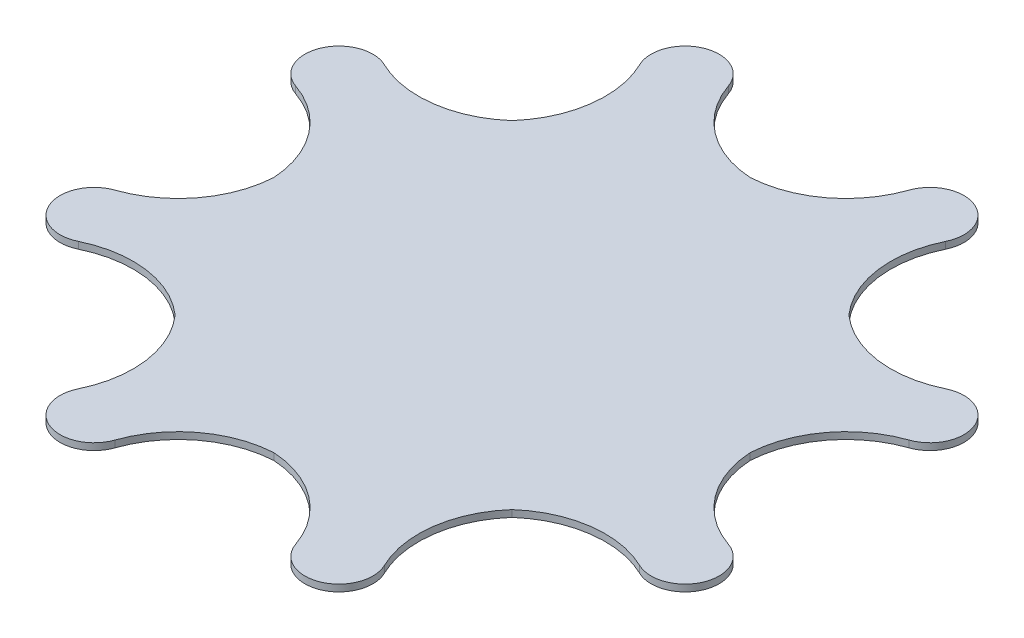
ISO-10303-21;
HEADER;
FILE_DESCRIPTION(('STEP AP214'),'2;1');
FILE_NAME('part.step','',(''),(''),'','','');
FILE_SCHEMA(('AUTOMOTIVE_DESIGN { 1 0 10303 214 1 1 1 1 }'));
ENDSEC;
DATA;
#1=APPLICATION_CONTEXT('core data for automotive mechanical design processes');
#2=APPLICATION_PROTOCOL_DEFINITION('international standard','automotive_design',2000,#1);
#3=PRODUCT_CONTEXT('',#1,'mechanical');
#4=PRODUCT('Part','Part','',(#3));
#5=PRODUCT_RELATED_PRODUCT_CATEGORY('part','',(#4));
#6=PRODUCT_DEFINITION_FORMATION('','',#4);
#7=PRODUCT_DEFINITION_CONTEXT('part definition',#1,'design');
#8=PRODUCT_DEFINITION('design','',#6,#7);
#9=PRODUCT_DEFINITION_SHAPE('','',#8);
#10=(LENGTH_UNIT() NAMED_UNIT(*) SI_UNIT(.MILLI.,.METRE.));
#11=(NAMED_UNIT(*) PLANE_ANGLE_UNIT() SI_UNIT($,.RADIAN.));
#12=(NAMED_UNIT(*) SI_UNIT($,.STERADIAN.) SOLID_ANGLE_UNIT());
#13=UNCERTAINTY_MEASURE_WITH_UNIT(LENGTH_MEASURE(1.E-05),#10,'distance_accuracy_value','');
#14=(GEOMETRIC_REPRESENTATION_CONTEXT(3) GLOBAL_UNCERTAINTY_ASSIGNED_CONTEXT((#13)) GLOBAL_UNIT_ASSIGNED_CONTEXT((#10,
#11,#12)) REPRESENTATION_CONTEXT('',''));
#15=CARTESIAN_POINT('',(0.,0.,0.));
#16=DIRECTION('',(0.,0.,1.));
#17=DIRECTION('',(1.,0.,0.));
#18=AXIS2_PLACEMENT_3D('',#15,#16,#17);
#19=CARTESIAN_POINT('',(1.79809645227152,2.,-100.));
#20=DIRECTION('',(0.,-1.,0.));
#21=DIRECTION('',(0.,0.,-1.));
#22=AXIS2_PLACEMENT_3D('',#19,#20,#21);
#23=CYLINDRICAL_SURFACE('',#22,30.);
#24=DIRECTION('',(0.,-1.,0.));
#25=VECTOR('',#24,1.);
#26=CARTESIAN_POINT('',(0.,1.,-70.0539343293927));
#27=LINE('',#26,#25);
#28=CARTESIAN_POINT('',(0.,0.,-70.0539343293927));
#29=VERTEX_POINT('',#28);
#30=CARTESIAN_POINT('',(0.,2.,-70.0539343293927));
#31=VERTEX_POINT('',#30);
#32=EDGE_CURVE('E441',#29,#31,#27,.F.);
#33=ORIENTED_EDGE('',*,*,#32,.F.);
#34=CARTESIAN_POINT('',(1.79809645227152,0.,-100.));
#35=DIRECTION('',(0.,-1.,0.));
#36=DIRECTION('',(0.,0.,1.));
#37=AXIS2_PLACEMENT_3D('',#34,#35,#36);
#38=CIRCLE('',#37,30.);
#39=CARTESIAN_POINT('',(-26.5504758869321,0.,-90.1837661840735));
#40=VERTEX_POINT('',#39);
#41=EDGE_CURVE('E444',#29,#40,#38,.T.);
#42=ORIENTED_EDGE('',*,*,#41,.T.);
#43=DIRECTION('',(0.,-1.,0.));
#44=VECTOR('',#43,1.);
#45=CARTESIAN_POINT('',(-26.5504758869321,2.,-90.1837661840735));
#46=LINE('',#45,#44);
#47=CARTESIAN_POINT('',(-26.5504758869321,2.,-90.1837661840735));
#48=VERTEX_POINT('',#47);
#49=EDGE_CURVE('E11',#48,#40,#46,.T.);
#50=ORIENTED_EDGE('',*,*,#49,.F.);
#51=CARTESIAN_POINT('',(1.79809645227152,2.,-100.));
#52=DIRECTION('',(0.,-1.,0.));
#53=DIRECTION('',(0.,0.,1.));
#54=AXIS2_PLACEMENT_3D('',#51,#52,#53);
#55=CIRCLE('',#54,30.);
#56=EDGE_CURVE('E68',#31,#48,#55,.T.);
#57=ORIENTED_EDGE('',*,*,#56,.F.);
#58=EDGE_LOOP('',(#33,#42,#50,#57));
#59=FACE_BOUND('',#58,.T.);
#60=ADVANCED_FACE('F45',(#59),#23,.F.);
#61=CARTESIAN_POINT('',(-71.9821243132834,2.,-69.4392319240261));
#62=DIRECTION('',(0.,-1.,0.));
#63=DIRECTION('',(0.,0.,-1.));
#64=AXIS2_PLACEMENT_3D('',#61,#62,#63);
#65=CYLINDRICAL_SURFACE('',#64,30.);
#66=DIRECTION('',(0.,-1.,0.));
#67=VECTOR('',#66,1.);
#68=CARTESIAN_POINT('',(-49.5356120131104,1.,-49.5356120131108));
#69=LINE('',#68,#67);
#70=CARTESIAN_POINT('',(-49.5356120131104,2.,-49.5356120131108));
#71=VERTEX_POINT('',#70);
#72=CARTESIAN_POINT('',(-49.5356120131104,0.,-49.5356120131108));
#73=VERTEX_POINT('',#72);
#74=EDGE_CURVE('E60',#71,#73,#69,.T.);
#75=ORIENTED_EDGE('',*,*,#74,.F.);
#76=CARTESIAN_POINT('',(-71.9821243132834,2.,-69.4392319240261));
#77=DIRECTION('',(0.,-1.,0.));
#78=DIRECTION('',(0.,0.,-1.));
#79=AXIS2_PLACEMENT_3D('',#76,#77,#78);
#80=CIRCLE('',#79,30.);
#81=CARTESIAN_POINT('',(-44.9955310783208,2.,-82.5435741650801));
#82=VERTEX_POINT('',#81);
#83=EDGE_CURVE('E214',#82,#71,#80,.T.);
#84=ORIENTED_EDGE('',*,*,#83,.F.);
#85=DIRECTION('',(0.,-1.,0.));
#86=VECTOR('',#85,1.);
#87=CARTESIAN_POINT('',(-44.9955310783208,2.,-82.5435741650801));
#88=LINE('',#87,#86);
#89=CARTESIAN_POINT('',(-44.9955310783208,0.,-82.5435741650801));
#90=VERTEX_POINT('',#89);
#91=EDGE_CURVE('E53',#82,#90,#88,.T.);
#92=ORIENTED_EDGE('',*,*,#91,.T.);
#93=CARTESIAN_POINT('',(-71.9821243132834,0.,-69.4392319240261));
#94=DIRECTION('',(0.,-1.,0.));
#95=DIRECTION('',(0.,0.,-1.));
#96=AXIS2_PLACEMENT_3D('',#93,#94,#95);
#97=CIRCLE('',#96,30.);
#98=EDGE_CURVE('E448',#90,#73,#97,.T.);
#99=ORIENTED_EDGE('',*,*,#98,.T.);
#100=EDGE_LOOP('',(#75,#84,#92,#99));
#101=FACE_BOUND('',#100,.T.);
#102=ADVANCED_FACE('F463',(#101),#65,.F.);
#103=CARTESIAN_POINT('',(-36.,2.,-86.9116882454314));
#104=DIRECTION('',(0.,-1.,0.));
#105=DIRECTION('',(0.,0.,-1.));
#106=AXIS2_PLACEMENT_3D('',#103,#104,#105);
#107=CYLINDRICAL_SURFACE('',#106,10.);
#108=CARTESIAN_POINT('',(-36.,0.,-86.9116882454314));
#109=DIRECTION('',(0.,1.,0.));
#110=DIRECTION('',(0.,0.,1.));
#111=AXIS2_PLACEMENT_3D('',#108,#109,#110);
#112=CIRCLE('',#111,10.);
#113=EDGE_CURVE('E455',#40,#90,#112,.T.);
#114=ORIENTED_EDGE('',*,*,#113,.T.);
#115=ORIENTED_EDGE('',*,*,#91,.F.);
#116=CARTESIAN_POINT('',(-36.,2.,-86.9116882454314));
#117=DIRECTION('',(0.,1.,0.));
#118=DIRECTION('',(0.,0.,1.));
#119=AXIS2_PLACEMENT_3D('',#116,#117,#118);
#120=CIRCLE('',#119,10.);
#121=EDGE_CURVE('E447',#48,#82,#120,.T.);
#122=ORIENTED_EDGE('',*,*,#121,.F.);
#123=ORIENTED_EDGE('',*,*,#49,.T.);
#124=EDGE_LOOP('',(#114,#115,#122,#123));
#125=FACE_BOUND('',#124,.T.);
#126=ADVANCED_FACE('F551',(#125),#107,.T.);
#127=CARTESIAN_POINT('',(1.79809645227152,2.,-100.));
#128=DIRECTION('',(0.,1.,0.));
#129=DIRECTION('',(0.,0.,1.));
#130=AXIS2_PLACEMENT_3D('',#127,#128,#129);
#131=PLANE('',#130);
#132=CARTESIAN_POINT('',(-1.79809645227137,2.,-100.));
#133=DIRECTION('',(0.,-1.,0.));
#134=DIRECTION('',(0.707106781186549,0.,-0.707106781186546));
#135=AXIS2_PLACEMENT_3D('',#132,#133,#134);
#136=CIRCLE('',#135,30.);
#137=CARTESIAN_POINT('',(26.5504758869323,2.,-90.1837661840735));
#138=VERTEX_POINT('',#137);
#139=EDGE_CURVE('E420',#138,#31,#136,.T.);
#140=ORIENTED_EDGE('',*,*,#139,.T.);
#141=ORIENTED_EDGE('',*,*,#56,.T.);
#142=ORIENTED_EDGE('',*,*,#121,.T.);
#143=ORIENTED_EDGE('',*,*,#83,.T.);
#144=CARTESIAN_POINT('',(-69.4392319240252,2.,-71.9821243132843));
#145=DIRECTION('',(0.,-1.,0.));
#146=DIRECTION('',(0.707106781186539,0.,0.707106781186556));
#147=AXIS2_PLACEMENT_3D('',#144,#145,#146);
#148=CIRCLE('',#147,30.);
#149=CARTESIAN_POINT('',(-82.5435741650795,2.,-44.9955310783218));
#150=VERTEX_POINT('',#149);
#151=EDGE_CURVE('E206',#71,#150,#148,.T.);
#152=ORIENTED_EDGE('',*,*,#151,.T.);
#153=CARTESIAN_POINT('',(-86.911688245431,2.,-36.0000000000011));
#154=DIRECTION('',(0.,1.,0.));
#155=DIRECTION('',(0.707106781186539,0.,0.707106781186556));
#156=AXIS2_PLACEMENT_3D('',#153,#154,#155);
#157=CIRCLE('',#156,10.);
#158=CARTESIAN_POINT('',(-90.1837661840732,2.,-26.5504758869332));
#159=VERTEX_POINT('',#158);
#160=EDGE_CURVE('E212',#150,#159,#157,.T.);
#161=ORIENTED_EDGE('',*,*,#160,.T.);
#162=CARTESIAN_POINT('',(-100.,2.,1.79809645227033));
#163=DIRECTION('',(0.,-1.,0.));
#164=DIRECTION('',(-0.707106781186539,0.,-0.707106781186556));
#165=AXIS2_PLACEMENT_3D('',#162,#163,#164);
#166=CIRCLE('',#165,30.);
#167=CARTESIAN_POINT('',(-70.0539343293926,2.,-8.85142653617166E-13));
#168=VERTEX_POINT('',#167);
#169=EDGE_CURVE('E234',#159,#168,#166,.T.);
#170=ORIENTED_EDGE('',*,*,#169,.T.);
#171=CARTESIAN_POINT('',(-100.,2.,-1.79809645227256));
#172=DIRECTION('',(0.,-1.,0.));
#173=DIRECTION('',(1.,0.,0.));
#174=AXIS2_PLACEMENT_3D('',#171,#172,#173);
#175=CIRCLE('',#174,30.);
#176=CARTESIAN_POINT('',(-90.1837661840738,2.,26.5504758869312));
#177=VERTEX_POINT('',#176);
#178=EDGE_CURVE('E253',#168,#177,#175,.T.);
#179=ORIENTED_EDGE('',*,*,#178,.T.);
#180=CARTESIAN_POINT('',(-86.9116882454318,2.,35.9999999999991));
#181=DIRECTION('',(0.,1.,0.));
#182=DIRECTION('',(1.,0.,0.));
#183=AXIS2_PLACEMENT_3D('',#180,#181,#182);
#184=CIRCLE('',#183,10.);
#185=CARTESIAN_POINT('',(-82.5435741650805,2.,44.99553107832));
#186=VERTEX_POINT('',#185);
#187=EDGE_CURVE('E256',#177,#186,#184,.T.);
#188=ORIENTED_EDGE('',*,*,#187,.T.);
#189=CARTESIAN_POINT('',(-69.4392319240268,2.,71.9821243132827));
#190=DIRECTION('',(0.,-1.,0.));
#191=DIRECTION('',(-1.,0.,0.));
#192=AXIS2_PLACEMENT_3D('',#189,#190,#191);
#193=CIRCLE('',#192,30.);
#194=CARTESIAN_POINT('',(-49.5356120131111,2.,49.5356120131101));
#195=VERTEX_POINT('',#194);
#196=EDGE_CURVE('E260',#186,#195,#193,.T.);
#197=ORIENTED_EDGE('',*,*,#196,.T.);
#198=CARTESIAN_POINT('',(-71.982124313284,2.,69.4392319240255));
#199=DIRECTION('',(0.,-1.,0.));
#200=DIRECTION('',(0.707106781186554,0.,-0.707106781186541));
#201=AXIS2_PLACEMENT_3D('',#198,#199,#200);
#202=CIRCLE('',#201,30.);
#203=CARTESIAN_POINT('',(-44.9955310783216,2.,82.5435741650797));
#204=VERTEX_POINT('',#203);
#205=EDGE_CURVE('E285',#195,#204,#202,.T.);
#206=ORIENTED_EDGE('',*,*,#205,.T.);
#207=CARTESIAN_POINT('',(-36.0000000000008,2.,86.9116882454311));
#208=DIRECTION('',(0.,1.,0.));
#209=DIRECTION('',(0.707106781186554,0.,-0.707106781186541));
#210=AXIS2_PLACEMENT_3D('',#207,#208,#209);
#211=CIRCLE('',#210,10.);
#212=CARTESIAN_POINT('',(-26.5504758869329,2.,90.1837661840733));
#213=VERTEX_POINT('',#212);
#214=EDGE_CURVE('E288',#204,#213,#211,.T.);
#215=ORIENTED_EDGE('',*,*,#214,.T.);
#216=CARTESIAN_POINT('',(1.79809645227067,2.,100.));
#217=DIRECTION('',(0.,-1.,0.));
#218=DIRECTION('',(-0.707106781186554,0.,0.707106781186541));
#219=AXIS2_PLACEMENT_3D('',#216,#217,#218);
#220=CIRCLE('',#219,30.);
#221=CARTESIAN_POINT('',(-3.07046055247895E-13,2.,70.0539343293926));
#222=VERTEX_POINT('',#221);
#223=EDGE_CURVE('E292',#213,#222,#220,.T.);
#224=ORIENTED_EDGE('',*,*,#223,.T.);
#225=CARTESIAN_POINT('',(-1.79809645227152,2.,100.));
#226=DIRECTION('',(0.,-1.,0.));
#227=DIRECTION('',(0.,0.,-1.));
#228=AXIS2_PLACEMENT_3D('',#225,#226,#227);
#229=CIRCLE('',#228,30.);
#230=CARTESIAN_POINT('',(26.5504758869321,2.,90.1837661840735));
#231=VERTEX_POINT('',#230);
#232=EDGE_CURVE('E317',#222,#231,#229,.T.);
#233=ORIENTED_EDGE('',*,*,#232,.T.);
#234=CARTESIAN_POINT('',(36.,2.,86.9116882454314));
#235=DIRECTION('',(0.,1.,0.));
#236=DIRECTION('',(0.,0.,-1.));
#237=AXIS2_PLACEMENT_3D('',#234,#235,#236);
#238=CIRCLE('',#237,10.);
#239=CARTESIAN_POINT('',(44.9955310783208,2.,82.5435741650801));
#240=VERTEX_POINT('',#239);
#241=EDGE_CURVE('E320',#231,#240,#238,.T.);
#242=ORIENTED_EDGE('',*,*,#241,.T.);
#243=CARTESIAN_POINT('',(71.9821243132834,2.,69.4392319240261));
#244=DIRECTION('',(0.,-1.,0.));
#245=DIRECTION('',(0.,0.,1.));
#246=AXIS2_PLACEMENT_3D('',#243,#244,#245);
#247=CIRCLE('',#246,30.);
#248=CARTESIAN_POINT('',(49.5356120131105,2.,49.5356120131107));
#249=VERTEX_POINT('',#248);
#250=EDGE_CURVE('E324',#240,#249,#247,.T.);
#251=ORIENTED_EDGE('',*,*,#250,.T.);
#252=CARTESIAN_POINT('',(69.4392319240257,2.,71.9821243132838));
#253=DIRECTION('',(0.,-1.,0.));
#254=DIRECTION('',(-0.707106781186544,0.,-0.707106781186551));
#255=AXIS2_PLACEMENT_3D('',#252,#253,#254);
#256=CIRCLE('',#255,30.);
#257=CARTESIAN_POINT('',(82.5435741650798,2.,44.9955310783213));
#258=VERTEX_POINT('',#257);
#259=EDGE_CURVE('E349',#249,#258,#256,.T.);
#260=ORIENTED_EDGE('',*,*,#259,.T.);
#261=CARTESIAN_POINT('',(86.9116882454313,2.,36.0000000000005));
#262=DIRECTION('',(0.,1.,0.));
#263=DIRECTION('',(-0.707106781186544,0.,-0.707106781186551));
#264=AXIS2_PLACEMENT_3D('',#261,#262,#263);
#265=CIRCLE('',#264,10.);
#266=CARTESIAN_POINT('',(90.1837661840734,2.,26.5504758869326));
#267=VERTEX_POINT('',#266);
#268=EDGE_CURVE('E352',#258,#267,#265,.T.);
#269=ORIENTED_EDGE('',*,*,#268,.T.);
#270=CARTESIAN_POINT('',(100.,2.,-1.79809645227102));
#271=DIRECTION('',(0.,-1.,0.));
#272=DIRECTION('',(0.707106781186544,0.,0.707106781186551));
#273=AXIS2_PLACEMENT_3D('',#270,#271,#272);
#274=CIRCLE('',#273,30.);
#275=CARTESIAN_POINT('',(70.0539343293927,2.,3.07696576551386E-13));
#276=VERTEX_POINT('',#275);
#277=EDGE_CURVE('E356',#267,#276,#274,.T.);
#278=ORIENTED_EDGE('',*,*,#277,.T.);
#279=CARTESIAN_POINT('',(100.,2.,1.79809645227186));
#280=DIRECTION('',(0.,-1.,0.));
#281=DIRECTION('',(-1.,0.,0.));
#282=AXIS2_PLACEMENT_3D('',#279,#280,#281);
#283=CIRCLE('',#282,30.);
#284=CARTESIAN_POINT('',(90.1837661840736,2.,-26.5504758869318));
#285=VERTEX_POINT('',#284);
#286=EDGE_CURVE('E381',#276,#285,#283,.T.);
#287=ORIENTED_EDGE('',*,*,#286,.T.);
#288=CARTESIAN_POINT('',(86.9116882454316,2.,-35.9999999999997));
#289=DIRECTION('',(0.,1.,0.));
#290=DIRECTION('',(-1.,0.,0.));
#291=AXIS2_PLACEMENT_3D('',#288,#289,#290);
#292=CIRCLE('',#291,10.);
#293=CARTESIAN_POINT('',(82.5435741650802,2.,-44.9955310783205));
#294=VERTEX_POINT('',#293);
#295=EDGE_CURVE('E384',#285,#294,#292,.T.);
#296=ORIENTED_EDGE('',*,*,#295,.T.);
#297=CARTESIAN_POINT('',(69.4392319240263,2.,-71.9821243132832));
#298=DIRECTION('',(0.,-1.,0.));
#299=DIRECTION('',(1.,0.,0.));
#300=AXIS2_PLACEMENT_3D('',#297,#298,#299);
#301=CIRCLE('',#300,30.);
#302=CARTESIAN_POINT('',(49.5356120131107,2.,-49.5356120131105));
#303=VERTEX_POINT('',#302);
#304=EDGE_CURVE('E388',#294,#303,#301,.T.);
#305=ORIENTED_EDGE('',*,*,#304,.T.);
#306=CARTESIAN_POINT('',(71.9821243132835,2.,-69.439231924026));
#307=DIRECTION('',(0.,-1.,0.));
#308=DIRECTION('',(-0.707106781186549,0.,0.707106781186546));
#309=AXIS2_PLACEMENT_3D('',#306,#307,#308);
#310=CIRCLE('',#309,30.);
#311=CARTESIAN_POINT('',(44.995531078321,2.,-82.54357416508));
#312=VERTEX_POINT('',#311);
#313=EDGE_CURVE('E413',#303,#312,#310,.T.);
#314=ORIENTED_EDGE('',*,*,#313,.T.);
#315=CARTESIAN_POINT('',(36.0000000000002,2.,-86.9116882454314));
#316=DIRECTION('',(0.,1.,0.));
#317=DIRECTION('',(-0.707106781186549,0.,0.707106781186546));
#318=AXIS2_PLACEMENT_3D('',#315,#316,#317);
#319=CIRCLE('',#318,10.);
#320=EDGE_CURVE('E416',#312,#138,#319,.T.);
#321=ORIENTED_EDGE('',*,*,#320,.T.);
#322=EDGE_LOOP('',(#140,#141,#142,#143,#152,#161,#170,#179,#188,#197,#206,#215,#224,#233,#242,
#251,#260,#269,#278,#287,#296,#305,#314,#321));
#323=FACE_BOUND('',#322,.T.);
#324=ADVANCED_FACE('F209',(#323),#131,.T.);
#325=CARTESIAN_POINT('',(1.79809645227152,0.,-100.));
#326=DIRECTION('',(0.,1.,0.));
#327=DIRECTION('',(0.,0.,1.));
#328=AXIS2_PLACEMENT_3D('',#325,#326,#327);
#329=PLANE('',#328);
#330=ORIENTED_EDGE('',*,*,#41,.F.);
#331=CARTESIAN_POINT('',(-1.79809645227137,0.,-100.));
#332=DIRECTION('',(0.,-1.,0.));
#333=DIRECTION('',(0.707106781186549,0.,-0.707106781186546));
#334=AXIS2_PLACEMENT_3D('',#331,#332,#333);
#335=CIRCLE('',#334,30.);
#336=CARTESIAN_POINT('',(26.5504758869323,0.,-90.1837661840735));
#337=VERTEX_POINT('',#336);
#338=EDGE_CURVE('E417',#337,#29,#335,.T.);
#339=ORIENTED_EDGE('',*,*,#338,.F.);
#340=CARTESIAN_POINT('',(36.0000000000002,0.,-86.9116882454314));
#341=DIRECTION('',(0.,1.,0.));
#342=DIRECTION('',(-0.707106781186549,0.,0.707106781186546));
#343=AXIS2_PLACEMENT_3D('',#340,#341,#342);
#344=CIRCLE('',#343,10.);
#345=CARTESIAN_POINT('',(44.995531078321,0.,-82.54357416508));
#346=VERTEX_POINT('',#345);
#347=EDGE_CURVE('E426',#346,#337,#344,.T.);
#348=ORIENTED_EDGE('',*,*,#347,.F.);
#349=CARTESIAN_POINT('',(71.9821243132835,0.,-69.439231924026));
#350=DIRECTION('',(0.,-1.,0.));
#351=DIRECTION('',(-0.707106781186549,0.,0.707106781186546));
#352=AXIS2_PLACEMENT_3D('',#349,#350,#351);
#353=CIRCLE('',#352,30.);
#354=CARTESIAN_POINT('',(49.5356120131107,0.,-49.5356120131105));
#355=VERTEX_POINT('',#354);
#356=EDGE_CURVE('E412',#355,#346,#353,.T.);
#357=ORIENTED_EDGE('',*,*,#356,.F.);
#358=CARTESIAN_POINT('',(69.4392319240263,0.,-71.9821243132832));
#359=DIRECTION('',(0.,-1.,0.));
#360=DIRECTION('',(1.,0.,0.));
#361=AXIS2_PLACEMENT_3D('',#358,#359,#360);
#362=CIRCLE('',#361,30.);
#363=CARTESIAN_POINT('',(82.5435741650802,0.,-44.9955310783205));
#364=VERTEX_POINT('',#363);
#365=EDGE_CURVE('E385',#364,#355,#362,.T.);
#366=ORIENTED_EDGE('',*,*,#365,.F.);
#367=CARTESIAN_POINT('',(86.9116882454316,0.,-35.9999999999997));
#368=DIRECTION('',(0.,1.,0.));
#369=DIRECTION('',(-1.,0.,0.));
#370=AXIS2_PLACEMENT_3D('',#367,#368,#369);
#371=CIRCLE('',#370,10.);
#372=CARTESIAN_POINT('',(90.1837661840736,0.,-26.5504758869318));
#373=VERTEX_POINT('',#372);
#374=EDGE_CURVE('E395',#373,#364,#371,.T.);
#375=ORIENTED_EDGE('',*,*,#374,.F.);
#376=CARTESIAN_POINT('',(100.,0.,1.79809645227186));
#377=DIRECTION('',(0.,-1.,0.));
#378=DIRECTION('',(-1.,0.,0.));
#379=AXIS2_PLACEMENT_3D('',#376,#377,#378);
#380=CIRCLE('',#379,30.);
#381=CARTESIAN_POINT('',(70.0539343293927,0.,3.07696576551386E-13));
#382=VERTEX_POINT('',#381);
#383=EDGE_CURVE('E380',#382,#373,#380,.T.);
#384=ORIENTED_EDGE('',*,*,#383,.F.);
#385=CARTESIAN_POINT('',(100.,0.,-1.79809645227102));
#386=DIRECTION('',(0.,-1.,0.));
#387=DIRECTION('',(0.707106781186544,0.,0.707106781186551));
#388=AXIS2_PLACEMENT_3D('',#385,#386,#387);
#389=CIRCLE('',#388,30.);
#390=CARTESIAN_POINT('',(90.1837661840734,0.,26.5504758869326));
#391=VERTEX_POINT('',#390);
#392=EDGE_CURVE('E353',#391,#382,#389,.T.);
#393=ORIENTED_EDGE('',*,*,#392,.F.);
#394=CARTESIAN_POINT('',(86.9116882454313,0.,36.0000000000005));
#395=DIRECTION('',(0.,1.,0.));
#396=DIRECTION('',(-0.707106781186544,0.,-0.707106781186551));
#397=AXIS2_PLACEMENT_3D('',#394,#395,#396);
#398=CIRCLE('',#397,10.);
#399=CARTESIAN_POINT('',(82.5435741650798,0.,44.9955310783213));
#400=VERTEX_POINT('',#399);
#401=EDGE_CURVE('E363',#400,#391,#398,.T.);
#402=ORIENTED_EDGE('',*,*,#401,.F.);
#403=CARTESIAN_POINT('',(69.4392319240257,0.,71.9821243132838));
#404=DIRECTION('',(0.,-1.,0.));
#405=DIRECTION('',(-0.707106781186544,0.,-0.707106781186551));
#406=AXIS2_PLACEMENT_3D('',#403,#404,#405);
#407=CIRCLE('',#406,30.);
#408=CARTESIAN_POINT('',(49.5356120131105,0.,49.5356120131107));
#409=VERTEX_POINT('',#408);
#410=EDGE_CURVE('E348',#409,#400,#407,.T.);
#411=ORIENTED_EDGE('',*,*,#410,.F.);
#412=CARTESIAN_POINT('',(71.9821243132834,0.,69.4392319240261));
#413=DIRECTION('',(0.,-1.,0.));
#414=DIRECTION('',(0.,0.,1.));
#415=AXIS2_PLACEMENT_3D('',#412,#413,#414);
#416=CIRCLE('',#415,30.);
#417=CARTESIAN_POINT('',(44.9955310783208,0.,82.5435741650801));
#418=VERTEX_POINT('',#417);
#419=EDGE_CURVE('E321',#418,#409,#416,.T.);
#420=ORIENTED_EDGE('',*,*,#419,.F.);
#421=CARTESIAN_POINT('',(36.,0.,86.9116882454314));
#422=DIRECTION('',(0.,1.,0.));
#423=DIRECTION('',(0.,0.,-1.));
#424=AXIS2_PLACEMENT_3D('',#421,#422,#423);
#425=CIRCLE('',#424,10.);
#426=CARTESIAN_POINT('',(26.5504758869321,0.,90.1837661840735));
#427=VERTEX_POINT('',#426);
#428=EDGE_CURVE('E331',#427,#418,#425,.T.);
#429=ORIENTED_EDGE('',*,*,#428,.F.);
#430=CARTESIAN_POINT('',(-1.79809645227152,0.,100.));
#431=DIRECTION('',(0.,-1.,0.));
#432=DIRECTION('',(0.,0.,-1.));
#433=AXIS2_PLACEMENT_3D('',#430,#431,#432);
#434=CIRCLE('',#433,30.);
#435=CARTESIAN_POINT('',(-3.06178693509906E-13,0.,70.0539343293926));
#436=VERTEX_POINT('',#435);
#437=EDGE_CURVE('E316',#436,#427,#434,.T.);
#438=ORIENTED_EDGE('',*,*,#437,.F.);
#439=CARTESIAN_POINT('',(1.79809645227067,0.,100.));
#440=DIRECTION('',(0.,-1.,0.));
#441=DIRECTION('',(-0.707106781186554,0.,0.707106781186541));
#442=AXIS2_PLACEMENT_3D('',#439,#440,#441);
#443=CIRCLE('',#442,30.);
#444=CARTESIAN_POINT('',(-26.5504758869329,0.,90.1837661840733));
#445=VERTEX_POINT('',#444);
#446=EDGE_CURVE('E289',#445,#436,#443,.T.);
#447=ORIENTED_EDGE('',*,*,#446,.F.);
#448=CARTESIAN_POINT('',(-36.0000000000008,0.,86.9116882454311));
#449=DIRECTION('',(0.,1.,0.));
#450=DIRECTION('',(0.707106781186554,0.,-0.707106781186541));
#451=AXIS2_PLACEMENT_3D('',#448,#449,#450);
#452=CIRCLE('',#451,10.);
#453=CARTESIAN_POINT('',(-44.9955310783216,0.,82.5435741650797));
#454=VERTEX_POINT('',#453);
#455=EDGE_CURVE('E299',#454,#445,#452,.T.);
#456=ORIENTED_EDGE('',*,*,#455,.F.);
#457=CARTESIAN_POINT('',(-71.982124313284,0.,69.4392319240255));
#458=DIRECTION('',(0.,-1.,0.));
#459=DIRECTION('',(0.707106781186554,0.,-0.707106781186541));
#460=AXIS2_PLACEMENT_3D('',#457,#458,#459);
#461=CIRCLE('',#460,30.);
#462=CARTESIAN_POINT('',(-49.5356120131111,0.,49.5356120131101));
#463=VERTEX_POINT('',#462);
#464=EDGE_CURVE('E284',#463,#454,#461,.T.);
#465=ORIENTED_EDGE('',*,*,#464,.F.);
#466=CARTESIAN_POINT('',(-69.4392319240268,0.,71.9821243132827));
#467=DIRECTION('',(0.,-1.,0.));
#468=DIRECTION('',(-1.,0.,0.));
#469=AXIS2_PLACEMENT_3D('',#466,#467,#468);
#470=CIRCLE('',#469,30.);
#471=CARTESIAN_POINT('',(-82.5435741650805,0.,44.99553107832));
#472=VERTEX_POINT('',#471);
#473=EDGE_CURVE('E257',#472,#463,#470,.T.);
#474=ORIENTED_EDGE('',*,*,#473,.F.);
#475=CARTESIAN_POINT('',(-86.9116882454318,0.,35.9999999999991));
#476=DIRECTION('',(0.,1.,0.));
#477=DIRECTION('',(1.,0.,0.));
#478=AXIS2_PLACEMENT_3D('',#475,#476,#477);
#479=CIRCLE('',#478,10.);
#480=CARTESIAN_POINT('',(-90.1837661840738,0.,26.5504758869312));
#481=VERTEX_POINT('',#480);
#482=EDGE_CURVE('E267',#481,#472,#479,.T.);
#483=ORIENTED_EDGE('',*,*,#482,.F.);
#484=CARTESIAN_POINT('',(-100.,0.,-1.79809645227256));
#485=DIRECTION('',(0.,-1.,0.));
#486=DIRECTION('',(1.,0.,0.));
#487=AXIS2_PLACEMENT_3D('',#484,#485,#486);
#488=CIRCLE('',#487,30.);
#489=CARTESIAN_POINT('',(-70.0539343293927,0.,-8.85142653617166E-13));
#490=VERTEX_POINT('',#489);
#491=EDGE_CURVE('E252',#490,#481,#488,.T.);
#492=ORIENTED_EDGE('',*,*,#491,.F.);
#493=CARTESIAN_POINT('',(-100.,0.,1.79809645227033));
#494=DIRECTION('',(0.,-1.,0.));
#495=DIRECTION('',(-0.707106781186539,0.,-0.707106781186556));
#496=AXIS2_PLACEMENT_3D('',#493,#494,#495);
#497=CIRCLE('',#496,30.);
#498=CARTESIAN_POINT('',(-90.1837661840732,0.,-26.5504758869332));
#499=VERTEX_POINT('',#498);
#500=EDGE_CURVE('E217',#499,#490,#497,.T.);
#501=ORIENTED_EDGE('',*,*,#500,.F.);
#502=CARTESIAN_POINT('',(-86.911688245431,0.,-36.0000000000011));
#503=DIRECTION('',(0.,1.,0.));
#504=DIRECTION('',(0.707106781186539,0.,0.707106781186556));
#505=AXIS2_PLACEMENT_3D('',#502,#503,#504);
#506=CIRCLE('',#505,10.);
#507=CARTESIAN_POINT('',(-82.5435741650795,0.,-44.9955310783218));
#508=VERTEX_POINT('',#507);
#509=EDGE_CURVE('E241',#508,#499,#506,.T.);
#510=ORIENTED_EDGE('',*,*,#509,.F.);
#511=CARTESIAN_POINT('',(-69.4392319240252,0.,-71.9821243132843));
#512=DIRECTION('',(0.,-1.,0.));
#513=DIRECTION('',(0.707106781186539,0.,0.707106781186556));
#514=AXIS2_PLACEMENT_3D('',#511,#512,#513);
#515=CIRCLE('',#514,30.);
#516=EDGE_CURVE('E223',#73,#508,#515,.T.);
#517=ORIENTED_EDGE('',*,*,#516,.F.);
#518=ORIENTED_EDGE('',*,*,#98,.F.);
#519=ORIENTED_EDGE('',*,*,#113,.F.);
#520=EDGE_LOOP('',(#330,#339,#348,#357,#366,#375,#384,#393,#402,#411,#420,#429,#438,#447,#456,
#465,#474,#483,#492,#501,#510,#517,#518,#519));
#521=FACE_BOUND('',#520,.T.);
#522=ADVANCED_FACE('F469',(#521),#329,.F.);
#523=CARTESIAN_POINT('',(-1.79809645227137,2.,-100.));
#524=DIRECTION('',(0.,-1.,0.));
#525=DIRECTION('',(0.,0.,-1.));
#526=AXIS2_PLACEMENT_3D('',#523,#524,#525);
#527=CYLINDRICAL_SURFACE('',#526,30.);
#528=ORIENTED_EDGE('',*,*,#338,.T.);
#529=ORIENTED_EDGE('',*,*,#32,.T.);
#530=ORIENTED_EDGE('',*,*,#139,.F.);
#531=DIRECTION('',(0.,-1.,0.));
#532=VECTOR('',#531,1.);
#533=CARTESIAN_POINT('',(26.5504758869323,2.,-90.1837661840735));
#534=LINE('',#533,#532);
#535=EDGE_CURVE('E423',#138,#337,#534,.T.);
#536=ORIENTED_EDGE('',*,*,#535,.T.);
#537=EDGE_LOOP('',(#528,#529,#530,#536));
#538=FACE_BOUND('',#537,.T.);
#539=ADVANCED_FACE('F550',(#538),#527,.F.);
#540=CARTESIAN_POINT('',(-69.4392319240252,2.,-71.9821243132843));
#541=DIRECTION('',(0.,-1.,0.));
#542=DIRECTION('',(0.,0.,-1.));
#543=AXIS2_PLACEMENT_3D('',#540,#541,#542);
#544=CYLINDRICAL_SURFACE('',#543,30.);
#545=ORIENTED_EDGE('',*,*,#151,.F.);
#546=ORIENTED_EDGE('',*,*,#74,.T.);
#547=ORIENTED_EDGE('',*,*,#516,.T.);
#548=DIRECTION('',(0.,-1.,0.));
#549=VECTOR('',#548,1.);
#550=CARTESIAN_POINT('',(-82.5435741650795,2.,-44.9955310783218));
#551=LINE('',#550,#549);
#552=EDGE_CURVE('E220',#150,#508,#551,.T.);
#553=ORIENTED_EDGE('',*,*,#552,.F.);
#554=EDGE_LOOP('',(#545,#546,#547,#553));
#555=FACE_BOUND('',#554,.T.);
#556=ADVANCED_FACE('F221',(#555),#544,.F.);
#557=CARTESIAN_POINT('',(71.9821243132835,2.,-69.439231924026));
#558=DIRECTION('',(0.,-1.,0.));
#559=DIRECTION('',(0.,0.,-1.));
#560=AXIS2_PLACEMENT_3D('',#557,#558,#559);
#561=CYLINDRICAL_SURFACE('',#560,30.);
#562=DIRECTION('',(0.,-1.,0.));
#563=VECTOR('',#562,1.);
#564=CARTESIAN_POINT('',(49.5356120131107,1.,-49.5356120131105));
#565=LINE('',#564,#563);
#566=EDGE_CURVE('E408',#355,#303,#565,.F.);
#567=ORIENTED_EDGE('',*,*,#566,.F.);
#568=ORIENTED_EDGE('',*,*,#356,.T.);
#569=DIRECTION('',(0.,-1.,0.));
#570=VECTOR('',#569,1.);
#571=CARTESIAN_POINT('',(44.995531078321,2.,-82.54357416508));
#572=LINE('',#571,#570);
#573=EDGE_CURVE('E435',#312,#346,#572,.T.);
#574=ORIENTED_EDGE('',*,*,#573,.F.);
#575=ORIENTED_EDGE('',*,*,#313,.F.);
#576=EDGE_LOOP('',(#567,#568,#574,#575));
#577=FACE_BOUND('',#576,.T.);
#578=ADVANCED_FACE('F542',(#577),#561,.F.);
#579=CARTESIAN_POINT('',(36.0000000000002,2.,-86.9116882454314));
#580=DIRECTION('',(0.,-1.,0.));
#581=DIRECTION('',(0.,0.,-1.));
#582=AXIS2_PLACEMENT_3D('',#579,#580,#581);
#583=CYLINDRICAL_SURFACE('',#582,10.);
#584=ORIENTED_EDGE('',*,*,#347,.T.);
#585=ORIENTED_EDGE('',*,*,#535,.F.);
#586=ORIENTED_EDGE('',*,*,#320,.F.);
#587=ORIENTED_EDGE('',*,*,#573,.T.);
#588=EDGE_LOOP('',(#584,#585,#586,#587));
#589=FACE_BOUND('',#588,.T.);
#590=ADVANCED_FACE('F546',(#589),#583,.T.);
#591=CARTESIAN_POINT('',(69.4392319240263,2.,-71.9821243132832));
#592=DIRECTION('',(0.,-1.,0.));
#593=DIRECTION('',(0.,0.,-1.));
#594=AXIS2_PLACEMENT_3D('',#591,#592,#593);
#595=CYLINDRICAL_SURFACE('',#594,30.);
#596=ORIENTED_EDGE('',*,*,#365,.T.);
#597=ORIENTED_EDGE('',*,*,#566,.T.);
#598=ORIENTED_EDGE('',*,*,#304,.F.);
#599=DIRECTION('',(0.,-1.,0.));
#600=VECTOR('',#599,1.);
#601=CARTESIAN_POINT('',(82.5435741650802,2.,-44.9955310783205));
#602=LINE('',#601,#600);
#603=EDGE_CURVE('E392',#294,#364,#602,.T.);
#604=ORIENTED_EDGE('',*,*,#603,.T.);
#605=EDGE_LOOP('',(#596,#597,#598,#604));
#606=FACE_BOUND('',#605,.T.);
#607=ADVANCED_FACE('F537',(#606),#595,.F.);
#608=CARTESIAN_POINT('',(100.,2.,1.79809645227186));
#609=DIRECTION('',(0.,-1.,0.));
#610=DIRECTION('',(0.,0.,-1.));
#611=AXIS2_PLACEMENT_3D('',#608,#609,#610);
#612=CYLINDRICAL_SURFACE('',#611,30.);
#613=DIRECTION('',(0.,-1.,0.));
#614=VECTOR('',#613,1.);
#615=CARTESIAN_POINT('',(70.0539343293927,1.,3.07696576551386E-13));
#616=LINE('',#615,#614);
#617=EDGE_CURVE('E376',#382,#276,#616,.F.);
#618=ORIENTED_EDGE('',*,*,#617,.F.);
#619=ORIENTED_EDGE('',*,*,#383,.T.);
#620=DIRECTION('',(0.,-1.,0.));
#621=VECTOR('',#620,1.);
#622=CARTESIAN_POINT('',(90.1837661840736,2.,-26.5504758869318));
#623=LINE('',#622,#621);
#624=EDGE_CURVE('E404',#285,#373,#623,.T.);
#625=ORIENTED_EDGE('',*,*,#624,.F.);
#626=ORIENTED_EDGE('',*,*,#286,.F.);
#627=EDGE_LOOP('',(#618,#619,#625,#626));
#628=FACE_BOUND('',#627,.T.);
#629=ADVANCED_FACE('F529',(#628),#612,.F.);
#630=CARTESIAN_POINT('',(86.9116882454316,2.,-35.9999999999997));
#631=DIRECTION('',(0.,-1.,0.));
#632=DIRECTION('',(0.,0.,-1.));
#633=AXIS2_PLACEMENT_3D('',#630,#631,#632);
#634=CYLINDRICAL_SURFACE('',#633,10.);
#635=ORIENTED_EDGE('',*,*,#374,.T.);
#636=ORIENTED_EDGE('',*,*,#603,.F.);
#637=ORIENTED_EDGE('',*,*,#295,.F.);
#638=ORIENTED_EDGE('',*,*,#624,.T.);
#639=EDGE_LOOP('',(#635,#636,#637,#638));
#640=FACE_BOUND('',#639,.T.);
#641=ADVANCED_FACE('F533',(#640),#634,.T.);
#642=CARTESIAN_POINT('',(100.,2.,-1.79809645227102));
#643=DIRECTION('',(0.,-1.,0.));
#644=DIRECTION('',(0.,0.,-1.));
#645=AXIS2_PLACEMENT_3D('',#642,#643,#644);
#646=CYLINDRICAL_SURFACE('',#645,30.);
#647=ORIENTED_EDGE('',*,*,#392,.T.);
#648=ORIENTED_EDGE('',*,*,#617,.T.);
#649=ORIENTED_EDGE('',*,*,#277,.F.);
#650=DIRECTION('',(0.,-1.,0.));
#651=VECTOR('',#650,1.);
#652=CARTESIAN_POINT('',(90.1837661840734,2.,26.5504758869326));
#653=LINE('',#652,#651);
#654=EDGE_CURVE('E360',#267,#391,#653,.T.);
#655=ORIENTED_EDGE('',*,*,#654,.T.);
#656=EDGE_LOOP('',(#647,#648,#649,#655));
#657=FACE_BOUND('',#656,.T.);
#658=ADVANCED_FACE('F524',(#657),#646,.F.);
#659=CARTESIAN_POINT('',(69.4392319240257,2.,71.9821243132838));
#660=DIRECTION('',(0.,-1.,0.));
#661=DIRECTION('',(0.,0.,-1.));
#662=AXIS2_PLACEMENT_3D('',#659,#660,#661);
#663=CYLINDRICAL_SURFACE('',#662,30.);
#664=DIRECTION('',(0.,-1.,0.));
#665=VECTOR('',#664,1.);
#666=CARTESIAN_POINT('',(49.5356120131105,1.,49.5356120131107));
#667=LINE('',#666,#665);
#668=EDGE_CURVE('E344',#409,#249,#667,.F.);
#669=ORIENTED_EDGE('',*,*,#668,.F.);
#670=ORIENTED_EDGE('',*,*,#410,.T.);
#671=DIRECTION('',(0.,-1.,0.));
#672=VECTOR('',#671,1.);
#673=CARTESIAN_POINT('',(82.5435741650798,2.,44.9955310783213));
#674=LINE('',#673,#672);
#675=EDGE_CURVE('E372',#258,#400,#674,.T.);
#676=ORIENTED_EDGE('',*,*,#675,.F.);
#677=ORIENTED_EDGE('',*,*,#259,.F.);
#678=EDGE_LOOP('',(#669,#670,#676,#677));
#679=FACE_BOUND('',#678,.T.);
#680=ADVANCED_FACE('F517',(#679),#663,.F.);
#681=CARTESIAN_POINT('',(86.9116882454313,2.,36.0000000000005));
#682=DIRECTION('',(0.,-1.,0.));
#683=DIRECTION('',(0.,0.,-1.));
#684=AXIS2_PLACEMENT_3D('',#681,#682,#683);
#685=CYLINDRICAL_SURFACE('',#684,10.);
#686=ORIENTED_EDGE('',*,*,#401,.T.);
#687=ORIENTED_EDGE('',*,*,#654,.F.);
#688=ORIENTED_EDGE('',*,*,#268,.F.);
#689=ORIENTED_EDGE('',*,*,#675,.T.);
#690=EDGE_LOOP('',(#686,#687,#688,#689));
#691=FACE_BOUND('',#690,.T.);
#692=ADVANCED_FACE('F520',(#691),#685,.T.);
#693=CARTESIAN_POINT('',(71.9821243132834,2.,69.4392319240261));
#694=DIRECTION('',(0.,-1.,0.));
#695=DIRECTION('',(0.,0.,-1.));
#696=AXIS2_PLACEMENT_3D('',#693,#694,#695);
#697=CYLINDRICAL_SURFACE('',#696,30.);
#698=ORIENTED_EDGE('',*,*,#419,.T.);
#699=ORIENTED_EDGE('',*,*,#668,.T.);
#700=ORIENTED_EDGE('',*,*,#250,.F.);
#701=DIRECTION('',(0.,-1.,0.));
#702=VECTOR('',#701,1.);
#703=CARTESIAN_POINT('',(44.9955310783208,2.,82.5435741650801));
#704=LINE('',#703,#702);
#705=EDGE_CURVE('E328',#240,#418,#704,.T.);
#706=ORIENTED_EDGE('',*,*,#705,.T.);
#707=EDGE_LOOP('',(#698,#699,#700,#706));
#708=FACE_BOUND('',#707,.T.);
#709=ADVANCED_FACE('F511',(#708),#697,.F.);
#710=CARTESIAN_POINT('',(-1.79809645227152,2.,100.));
#711=DIRECTION('',(0.,-1.,0.));
#712=DIRECTION('',(0.,0.,-1.));
#713=AXIS2_PLACEMENT_3D('',#710,#711,#712);
#714=CYLINDRICAL_SURFACE('',#713,30.);
#715=DIRECTION('',(0.,-1.,0.));
#716=VECTOR('',#715,1.);
#717=CARTESIAN_POINT('',(-3.06612374378901E-13,1.,70.0539343293926));
#718=LINE('',#717,#716);
#719=EDGE_CURVE('E312',#436,#222,#718,.F.);
#720=ORIENTED_EDGE('',*,*,#719,.F.);
#721=ORIENTED_EDGE('',*,*,#437,.T.);
#722=DIRECTION('',(0.,-1.,0.));
#723=VECTOR('',#722,1.);
#724=CARTESIAN_POINT('',(26.5504758869321,2.,90.1837661840735));
#725=LINE('',#724,#723);
#726=EDGE_CURVE('E340',#231,#427,#725,.T.);
#727=ORIENTED_EDGE('',*,*,#726,.F.);
#728=ORIENTED_EDGE('',*,*,#232,.F.);
#729=EDGE_LOOP('',(#720,#721,#727,#728));
#730=FACE_BOUND('',#729,.T.);
#731=ADVANCED_FACE('F504',(#730),#714,.F.);
#732=CARTESIAN_POINT('',(36.,2.,86.9116882454314));
#733=DIRECTION('',(0.,-1.,0.));
#734=DIRECTION('',(0.,0.,-1.));
#735=AXIS2_PLACEMENT_3D('',#732,#733,#734);
#736=CYLINDRICAL_SURFACE('',#735,10.);
#737=ORIENTED_EDGE('',*,*,#428,.T.);
#738=ORIENTED_EDGE('',*,*,#705,.F.);
#739=ORIENTED_EDGE('',*,*,#241,.F.);
#740=ORIENTED_EDGE('',*,*,#726,.T.);
#741=EDGE_LOOP('',(#737,#738,#739,#740));
#742=FACE_BOUND('',#741,.T.);
#743=ADVANCED_FACE('F507',(#742),#736,.T.);
#744=CARTESIAN_POINT('',(1.79809645227067,2.,100.));
#745=DIRECTION('',(0.,-1.,0.));
#746=DIRECTION('',(0.,0.,-1.));
#747=AXIS2_PLACEMENT_3D('',#744,#745,#746);
#748=CYLINDRICAL_SURFACE('',#747,30.);
#749=ORIENTED_EDGE('',*,*,#446,.T.);
#750=ORIENTED_EDGE('',*,*,#719,.T.);
#751=ORIENTED_EDGE('',*,*,#223,.F.);
#752=DIRECTION('',(0.,-1.,0.));
#753=VECTOR('',#752,1.);
#754=CARTESIAN_POINT('',(-26.5504758869329,2.,90.1837661840733));
#755=LINE('',#754,#753);
#756=EDGE_CURVE('E296',#213,#445,#755,.T.);
#757=ORIENTED_EDGE('',*,*,#756,.T.);
#758=EDGE_LOOP('',(#749,#750,#751,#757));
#759=FACE_BOUND('',#758,.T.);
#760=ADVANCED_FACE('F498',(#759),#748,.F.);
#761=CARTESIAN_POINT('',(-71.982124313284,2.,69.4392319240255));
#762=DIRECTION('',(0.,-1.,0.));
#763=DIRECTION('',(0.,0.,-1.));
#764=AXIS2_PLACEMENT_3D('',#761,#762,#763);
#765=CYLINDRICAL_SURFACE('',#764,30.);
#766=DIRECTION('',(0.,-1.,0.));
#767=VECTOR('',#766,1.);
#768=CARTESIAN_POINT('',(-49.5356120131111,1.,49.5356120131101));
#769=LINE('',#768,#767);
#770=EDGE_CURVE('E280',#463,#195,#769,.F.);
#771=ORIENTED_EDGE('',*,*,#770,.F.);
#772=ORIENTED_EDGE('',*,*,#464,.T.);
#773=DIRECTION('',(0.,-1.,0.));
#774=VECTOR('',#773,1.);
#775=CARTESIAN_POINT('',(-44.9955310783216,2.,82.5435741650797));
#776=LINE('',#775,#774);
#777=EDGE_CURVE('E308',#204,#454,#776,.T.);
#778=ORIENTED_EDGE('',*,*,#777,.F.);
#779=ORIENTED_EDGE('',*,*,#205,.F.);
#780=EDGE_LOOP('',(#771,#772,#778,#779));
#781=FACE_BOUND('',#780,.T.);
#782=ADVANCED_FACE('F491',(#781),#765,.F.);
#783=CARTESIAN_POINT('',(-36.0000000000008,2.,86.9116882454311));
#784=DIRECTION('',(0.,-1.,0.));
#785=DIRECTION('',(0.,0.,-1.));
#786=AXIS2_PLACEMENT_3D('',#783,#784,#785);
#787=CYLINDRICAL_SURFACE('',#786,10.);
#788=ORIENTED_EDGE('',*,*,#455,.T.);
#789=ORIENTED_EDGE('',*,*,#756,.F.);
#790=ORIENTED_EDGE('',*,*,#214,.F.);
#791=ORIENTED_EDGE('',*,*,#777,.T.);
#792=EDGE_LOOP('',(#788,#789,#790,#791));
#793=FACE_BOUND('',#792,.T.);
#794=ADVANCED_FACE('F494',(#793),#787,.T.);
#795=CARTESIAN_POINT('',(-69.4392319240268,2.,71.9821243132827));
#796=DIRECTION('',(0.,-1.,0.));
#797=DIRECTION('',(0.,0.,-1.));
#798=AXIS2_PLACEMENT_3D('',#795,#796,#797);
#799=CYLINDRICAL_SURFACE('',#798,30.);
#800=ORIENTED_EDGE('',*,*,#473,.T.);
#801=ORIENTED_EDGE('',*,*,#770,.T.);
#802=ORIENTED_EDGE('',*,*,#196,.F.);
#803=DIRECTION('',(0.,-1.,0.));
#804=VECTOR('',#803,1.);
#805=CARTESIAN_POINT('',(-82.5435741650805,2.,44.99553107832));
#806=LINE('',#805,#804);
#807=EDGE_CURVE('E264',#186,#472,#806,.T.);
#808=ORIENTED_EDGE('',*,*,#807,.T.);
#809=EDGE_LOOP('',(#800,#801,#802,#808));
#810=FACE_BOUND('',#809,.T.);
#811=ADVANCED_FACE('F485',(#810),#799,.F.);
#812=CARTESIAN_POINT('',(-100.,2.,-1.79809645227256));
#813=DIRECTION('',(0.,-1.,0.));
#814=DIRECTION('',(0.,0.,-1.));
#815=AXIS2_PLACEMENT_3D('',#812,#813,#814);
#816=CYLINDRICAL_SURFACE('',#815,30.);
#817=DIRECTION('',(0.,-1.,0.));
#818=VECTOR('',#817,1.);
#819=CARTESIAN_POINT('',(-70.0539343293927,0.999999999999999,-8.84708972748172E-13));
#820=LINE('',#819,#818);
#821=EDGE_CURVE('E227',#490,#168,#820,.F.);
#822=ORIENTED_EDGE('',*,*,#821,.F.);
#823=ORIENTED_EDGE('',*,*,#491,.T.);
#824=DIRECTION('',(0.,-1.,0.));
#825=VECTOR('',#824,1.);
#826=CARTESIAN_POINT('',(-90.1837661840738,2.,26.5504758869312));
#827=LINE('',#826,#825);
#828=EDGE_CURVE('E276',#177,#481,#827,.T.);
#829=ORIENTED_EDGE('',*,*,#828,.F.);
#830=ORIENTED_EDGE('',*,*,#178,.F.);
#831=EDGE_LOOP('',(#822,#823,#829,#830));
#832=FACE_BOUND('',#831,.T.);
#833=ADVANCED_FACE('F478',(#832),#816,.F.);
#834=CARTESIAN_POINT('',(-86.9116882454318,2.,35.9999999999991));
#835=DIRECTION('',(0.,-1.,0.));
#836=DIRECTION('',(0.,0.,-1.));
#837=AXIS2_PLACEMENT_3D('',#834,#835,#836);
#838=CYLINDRICAL_SURFACE('',#837,10.);
#839=ORIENTED_EDGE('',*,*,#482,.T.);
#840=ORIENTED_EDGE('',*,*,#807,.F.);
#841=ORIENTED_EDGE('',*,*,#187,.F.);
#842=ORIENTED_EDGE('',*,*,#828,.T.);
#843=EDGE_LOOP('',(#839,#840,#841,#842));
#844=FACE_BOUND('',#843,.T.);
#845=ADVANCED_FACE('F481',(#844),#838,.T.);
#846=CARTESIAN_POINT('',(-100.,2.,1.79809645227033));
#847=DIRECTION('',(0.,-1.,0.));
#848=DIRECTION('',(0.,0.,-1.));
#849=AXIS2_PLACEMENT_3D('',#846,#847,#848);
#850=CYLINDRICAL_SURFACE('',#849,30.);
#851=ORIENTED_EDGE('',*,*,#500,.T.);
#852=ORIENTED_EDGE('',*,*,#821,.T.);
#853=ORIENTED_EDGE('',*,*,#169,.F.);
#854=DIRECTION('',(0.,-1.,0.));
#855=VECTOR('',#854,1.);
#856=CARTESIAN_POINT('',(-90.1837661840732,2.,-26.5504758869332));
#857=LINE('',#856,#855);
#858=EDGE_CURVE('E228',#159,#499,#857,.T.);
#859=ORIENTED_EDGE('',*,*,#858,.T.);
#860=EDGE_LOOP('',(#851,#852,#853,#859));
#861=FACE_BOUND('',#860,.T.);
#862=ADVANCED_FACE('F472',(#861),#850,.F.);
#863=CARTESIAN_POINT('',(-86.911688245431,2.,-36.0000000000011));
#864=DIRECTION('',(0.,-1.,0.));
#865=DIRECTION('',(0.,0.,-1.));
#866=AXIS2_PLACEMENT_3D('',#863,#864,#865);
#867=CYLINDRICAL_SURFACE('',#866,10.);
#868=ORIENTED_EDGE('',*,*,#509,.T.);
#869=ORIENTED_EDGE('',*,*,#858,.F.);
#870=ORIENTED_EDGE('',*,*,#160,.F.);
#871=ORIENTED_EDGE('',*,*,#552,.T.);
#872=EDGE_LOOP('',(#868,#869,#870,#871));
#873=FACE_BOUND('',#872,.T.);
#874=ADVANCED_FACE('F230',(#873),#867,.T.);
#875=CLOSED_SHELL('',(#60,#102,#126,#324,#522,#539,#556,#578,#590,#607,#629,#641,#658,#680,#692,
#709,#731,#743,#760,#782,#794,#811,#833,#845,#862,#874));
#876=MANIFOLD_SOLID_BREP('B2',#875);
#877=ADVANCED_BREP_SHAPE_REPRESENTATION('',(#18,#876),#14);
#878=SHAPE_DEFINITION_REPRESENTATION(#9,#877);
ENDSEC;
END-ISO-10303-21;
